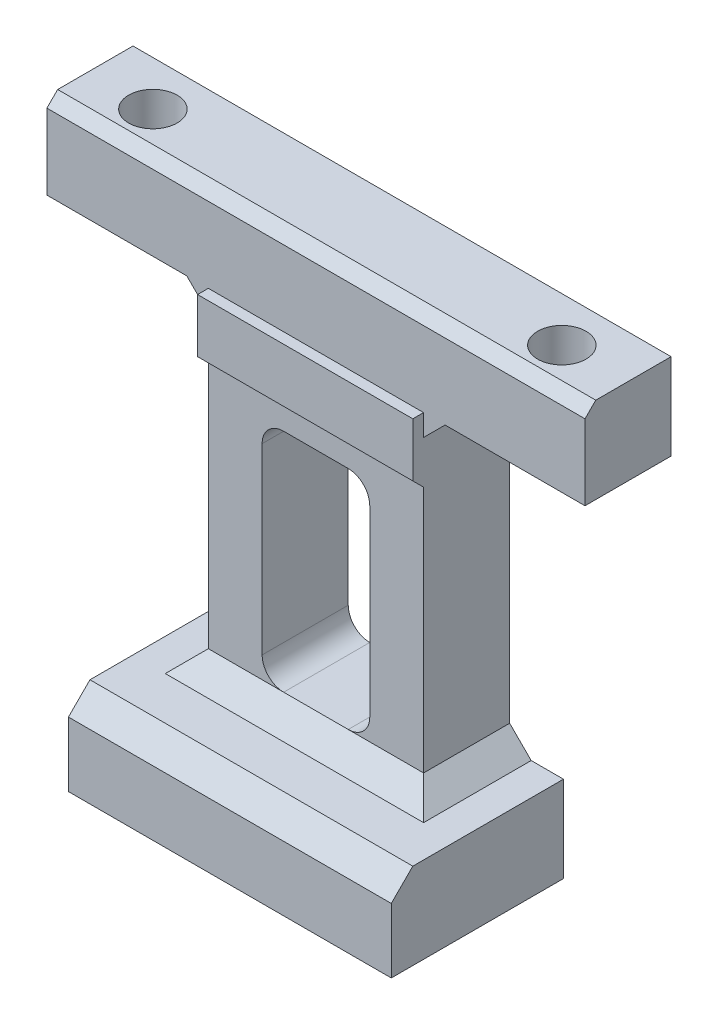
ISO-10303-21;
HEADER;
FILE_DESCRIPTION(('STEP AP214'),'2;1');
FILE_NAME('part.step','',(''),(''),'','','');
FILE_SCHEMA(('AUTOMOTIVE_DESIGN { 1 0 10303 214 1 1 1 1 }'));
ENDSEC;
DATA;
#1=APPLICATION_CONTEXT('core data for automotive mechanical design processes');
#2=APPLICATION_PROTOCOL_DEFINITION('international standard','automotive_design',2000,#1);
#3=PRODUCT_CONTEXT('',#1,'mechanical');
#4=PRODUCT('Part','Part','',(#3));
#5=PRODUCT_RELATED_PRODUCT_CATEGORY('part','',(#4));
#6=PRODUCT_DEFINITION_FORMATION('','',#4);
#7=PRODUCT_DEFINITION_CONTEXT('part definition',#1,'design');
#8=PRODUCT_DEFINITION('design','',#6,#7);
#9=PRODUCT_DEFINITION_SHAPE('','',#8);
#10=(LENGTH_UNIT() NAMED_UNIT(*) SI_UNIT(.MILLI.,.METRE.));
#11=(NAMED_UNIT(*) PLANE_ANGLE_UNIT() SI_UNIT($,.RADIAN.));
#12=(NAMED_UNIT(*) SI_UNIT($,.STERADIAN.) SOLID_ANGLE_UNIT());
#13=UNCERTAINTY_MEASURE_WITH_UNIT(LENGTH_MEASURE(1.E-05),#10,'distance_accuracy_value','');
#14=(GEOMETRIC_REPRESENTATION_CONTEXT(3) GLOBAL_UNCERTAINTY_ASSIGNED_CONTEXT((#13)) GLOBAL_UNIT_ASSIGNED_CONTEXT((#10,
#11,#12)) REPRESENTATION_CONTEXT('',''));
#15=CARTESIAN_POINT('',(0.,0.,0.));
#16=DIRECTION('',(0.,0.,1.));
#17=DIRECTION('',(1.,0.,0.));
#18=AXIS2_PLACEMENT_3D('',#15,#16,#17);
#19=CARTESIAN_POINT('',(0.,0.,0.));
#20=DIRECTION('',(0.,0.,1.));
#21=DIRECTION('',(1.,0.,0.));
#22=AXIS2_PLACEMENT_3D('',#19,#20,#21);
#23=PLANE('',#22);
#24=DIRECTION('',(0.,-1.,0.));
#25=VECTOR('',#24,1.);
#26=CARTESIAN_POINT('',(-10.,39.,0.));
#27=LINE('',#26,#25);
#28=CARTESIAN_POINT('',(-10.,33.,0.));
#29=VERTEX_POINT('',#28);
#30=CARTESIAN_POINT('',(-9.99999999999999,9.99999999999999,0.));
#31=VERTEX_POINT('',#30);
#32=EDGE_CURVE('E463',#29,#31,#27,.T.);
#33=ORIENTED_EDGE('',*,*,#32,.T.);
#34=DIRECTION('',(1.,0.,0.));
#35=VECTOR('',#34,1.);
#36=CARTESIAN_POINT('',(0.,9.99999999999999,0.));
#37=LINE('',#36,#35);
#38=CARTESIAN_POINT('',(-3.,9.99999999999999,0.));
#39=VERTEX_POINT('',#38);
#40=EDGE_CURVE('E619',#31,#39,#37,.T.);
#41=ORIENTED_EDGE('',*,*,#40,.T.);
#42=CARTESIAN_POINT('',(-3.,12.,0.));
#43=DIRECTION('',(0.,0.,1.));
#44=DIRECTION('',(1.,0.,0.));
#45=AXIS2_PLACEMENT_3D('',#42,#43,#44);
#46=CIRCLE('',#45,2.);
#47=CARTESIAN_POINT('',(-5.,12.,0.));
#48=VERTEX_POINT('',#47);
#49=EDGE_CURVE('E585',#39,#48,#46,.F.);
#50=ORIENTED_EDGE('',*,*,#49,.T.);
#51=DIRECTION('',(0.,-1.,0.));
#52=VECTOR('',#51,1.);
#53=CARTESIAN_POINT('',(-5.,31.,0.));
#54=LINE('',#53,#52);
#55=CARTESIAN_POINT('',(-5.,29.,0.));
#56=VERTEX_POINT('',#55);
#57=EDGE_CURVE('E372',#56,#48,#54,.T.);
#58=ORIENTED_EDGE('',*,*,#57,.F.);
#59=CARTESIAN_POINT('',(-3.,29.,0.));
#60=DIRECTION('',(0.,0.,1.));
#61=DIRECTION('',(1.,0.,0.));
#62=AXIS2_PLACEMENT_3D('',#59,#60,#61);
#63=CIRCLE('',#62,2.);
#64=CARTESIAN_POINT('',(-3.,31.,0.));
#65=VERTEX_POINT('',#64);
#66=EDGE_CURVE('E579',#56,#65,#63,.F.);
#67=ORIENTED_EDGE('',*,*,#66,.T.);
#68=DIRECTION('',(-1.,0.,0.));
#69=VECTOR('',#68,1.);
#70=CARTESIAN_POINT('',(-5.,31.,0.));
#71=LINE('',#70,#69);
#72=CARTESIAN_POINT('',(3.,31.,0.));
#73=VERTEX_POINT('',#72);
#74=EDGE_CURVE('E368',#73,#65,#71,.T.);
#75=ORIENTED_EDGE('',*,*,#74,.F.);
#76=CARTESIAN_POINT('',(3.,29.,0.));
#77=DIRECTION('',(0.,0.,1.));
#78=DIRECTION('',(1.,0.,0.));
#79=AXIS2_PLACEMENT_3D('',#76,#77,#78);
#80=CIRCLE('',#79,2.);
#81=CARTESIAN_POINT('',(5.,29.,0.));
#82=VERTEX_POINT('',#81);
#83=EDGE_CURVE('E573',#73,#82,#80,.F.);
#84=ORIENTED_EDGE('',*,*,#83,.T.);
#85=DIRECTION('',(0.,1.,0.));
#86=VECTOR('',#85,1.);
#87=CARTESIAN_POINT('',(5.,31.,0.));
#88=LINE('',#87,#86);
#89=CARTESIAN_POINT('',(5.,12.,0.));
#90=VERTEX_POINT('',#89);
#91=EDGE_CURVE('E336',#90,#82,#88,.T.);
#92=ORIENTED_EDGE('',*,*,#91,.F.);
#93=CARTESIAN_POINT('',(3.,12.,0.));
#94=DIRECTION('',(0.,0.,1.));
#95=DIRECTION('',(1.,0.,0.));
#96=AXIS2_PLACEMENT_3D('',#93,#94,#95);
#97=CIRCLE('',#96,2.);
#98=CARTESIAN_POINT('',(3.,9.99999999999999,0.));
#99=VERTEX_POINT('',#98);
#100=EDGE_CURVE('E567',#90,#99,#97,.F.);
#101=ORIENTED_EDGE('',*,*,#100,.T.);
#102=DIRECTION('',(1.,0.,0.));
#103=VECTOR('',#102,1.);
#104=CARTESIAN_POINT('',(0.,9.99999999999999,0.));
#105=LINE('',#104,#103);
#106=CARTESIAN_POINT('',(10.,9.99999999999999,0.));
#107=VERTEX_POINT('',#106);
#108=EDGE_CURVE('E96',#99,#107,#105,.T.);
#109=ORIENTED_EDGE('',*,*,#108,.T.);
#110=DIRECTION('',(0.,1.,0.));
#111=VECTOR('',#110,1.);
#112=CARTESIAN_POINT('',(10.,5.,0.));
#113=LINE('',#112,#111);
#114=CARTESIAN_POINT('',(10.,33.,0.));
#115=VERTEX_POINT('',#114);
#116=EDGE_CURVE('E460',#107,#115,#113,.T.);
#117=ORIENTED_EDGE('',*,*,#116,.T.);
#118=DIRECTION('',(-1.,0.,0.));
#119=VECTOR('',#118,1.);
#120=CARTESIAN_POINT('',(0.,33.,0.));
#121=LINE('',#120,#119);
#122=EDGE_CURVE('E523',#115,#29,#121,.T.);
#123=ORIENTED_EDGE('',*,*,#122,.T.);
#124=EDGE_LOOP('',(#33,#41,#50,#58,#67,#75,#84,#92,#101,#109,#117,#123));
#125=FACE_BOUND('',#124,.T.);
#126=ADVANCED_FACE('F77',(#125),#23,.T.);
#127=DIRECTION('',(0.,1.,0.));
#128=VECTOR('',#127,1.);
#129=CARTESIAN_POINT('',(25.,39.,0.));
#130=LINE('',#129,#128);
#131=CARTESIAN_POINT('',(25.,39.,0.));
#132=VERTEX_POINT('',#131);
#133=CARTESIAN_POINT('',(25.,46.,0.));
#134=VERTEX_POINT('',#133);
#135=EDGE_CURVE('E414',#132,#134,#130,.T.);
#136=ORIENTED_EDGE('',*,*,#135,.T.);
#137=DIRECTION('',(-1.,0.,0.));
#138=VECTOR('',#137,1.);
#139=CARTESIAN_POINT('',(0.,46.,0.));
#140=LINE('',#139,#138);
#141=CARTESIAN_POINT('',(-25.,46.,0.));
#142=VERTEX_POINT('',#141);
#143=EDGE_CURVE('E444',#134,#142,#140,.T.);
#144=ORIENTED_EDGE('',*,*,#143,.T.);
#145=DIRECTION('',(0.,-1.,0.));
#146=VECTOR('',#145,1.);
#147=CARTESIAN_POINT('',(-25.,47.,0.));
#148=LINE('',#147,#146);
#149=CARTESIAN_POINT('',(-25.,39.,0.));
#150=VERTEX_POINT('',#149);
#151=EDGE_CURVE('E428',#142,#150,#148,.T.);
#152=ORIENTED_EDGE('',*,*,#151,.T.);
#153=DIRECTION('',(1.,0.,0.));
#154=VECTOR('',#153,1.);
#155=CARTESIAN_POINT('',(-25.,39.,0.));
#156=LINE('',#155,#154);
#157=CARTESIAN_POINT('',(-12.,39.,0.));
#158=VERTEX_POINT('',#157);
#159=EDGE_CURVE('E433',#150,#158,#156,.T.);
#160=ORIENTED_EDGE('',*,*,#159,.T.);
#161=DIRECTION('',(-0.707106781186552,0.707106781186543,0.));
#162=VECTOR('',#161,1.);
#163=CARTESIAN_POINT('',(-12.,39.,0.));
#164=LINE('',#163,#162);
#165=CARTESIAN_POINT('',(-10.,37.,0.));
#166=VERTEX_POINT('',#165);
#167=EDGE_CURVE('E517',#158,#166,#164,.F.);
#168=ORIENTED_EDGE('',*,*,#167,.T.);
#169=DIRECTION('',(0.,-1.,0.));
#170=VECTOR('',#169,1.);
#171=CARTESIAN_POINT('',(-9.99999999999999,0.,0.));
#172=LINE('',#171,#170);
#173=CARTESIAN_POINT('',(-10.,39.,0.));
#174=VERTEX_POINT('',#173);
#175=EDGE_CURVE('E506',#174,#166,#172,.T.);
#176=ORIENTED_EDGE('',*,*,#175,.F.);
#177=DIRECTION('',(-1.,0.,0.));
#178=VECTOR('',#177,1.);
#179=CARTESIAN_POINT('',(-10.,39.,0.));
#180=LINE('',#179,#178);
#181=CARTESIAN_POINT('',(10.,39.,0.));
#182=VERTEX_POINT('',#181);
#183=EDGE_CURVE('E391',#182,#174,#180,.T.);
#184=ORIENTED_EDGE('',*,*,#183,.F.);
#185=DIRECTION('',(0.,1.,0.));
#186=VECTOR('',#185,1.);
#187=CARTESIAN_POINT('',(10.,0.,0.));
#188=LINE('',#187,#186);
#189=CARTESIAN_POINT('',(10.,37.,0.));
#190=VERTEX_POINT('',#189);
#191=EDGE_CURVE('E489',#190,#182,#188,.T.);
#192=ORIENTED_EDGE('',*,*,#191,.F.);
#193=DIRECTION('',(-0.707106781186542,-0.707106781186553,0.));
#194=VECTOR('',#193,1.);
#195=CARTESIAN_POINT('',(10.,37.,0.));
#196=LINE('',#195,#194);
#197=CARTESIAN_POINT('',(12.,39.,0.));
#198=VERTEX_POINT('',#197);
#199=EDGE_CURVE('E510',#190,#198,#196,.F.);
#200=ORIENTED_EDGE('',*,*,#199,.T.);
#201=EDGE_CURVE('E431',#198,#132,#156,.T.);
#202=ORIENTED_EDGE('',*,*,#201,.T.);
#203=EDGE_LOOP('',(#136,#144,#152,#160,#168,#176,#184,#192,#200,#202));
#204=FACE_BOUND('',#203,.T.);
#205=ADVANCED_FACE('F680',(#204),#23,.T.);
#206=CARTESIAN_POINT('',(25.,47.,-8.));
#207=DIRECTION('',(0.,1.,0.));
#208=DIRECTION('',(-1.,0.,0.));
#209=AXIS2_PLACEMENT_3D('',#206,#207,#208);
#210=PLANE('',#209);
#211=CARTESIAN_POINT('',(19.,47.,-3.8474065138723));
#212=DIRECTION('',(0.,1.,0.));
#213=DIRECTION('',(-1.,0.,0.));
#214=AXIS2_PLACEMENT_3D('',#211,#212,#213);
#215=CIRCLE('',#214,2.25);
#216=CARTESIAN_POINT('',(16.75,47.,-3.8474065138723));
#217=VERTEX_POINT('',#216);
#218=EDGE_CURVE('E379',#217,#217,#215,.T.);
#219=ORIENTED_EDGE('',*,*,#218,.F.);
#220=EDGE_LOOP('',(#219));
#221=FACE_BOUND('',#220,.T.);
#222=CARTESIAN_POINT('',(-19.,47.,-3.8474065138723));
#223=DIRECTION('',(0.,1.,0.));
#224=DIRECTION('',(-1.,0.,0.));
#225=AXIS2_PLACEMENT_3D('',#222,#223,#224);
#226=CIRCLE('',#225,2.25);
#227=CARTESIAN_POINT('',(-21.25,47.,-3.8474065138723));
#228=VERTEX_POINT('',#227);
#229=EDGE_CURVE('E290',#228,#228,#226,.T.);
#230=ORIENTED_EDGE('',*,*,#229,.F.);
#231=EDGE_LOOP('',(#230));
#232=FACE_BOUND('',#231,.T.);
#233=DIRECTION('',(0.,0.,1.));
#234=VECTOR('',#233,1.);
#235=CARTESIAN_POINT('',(-25.,47.,-8.));
#236=LINE('',#235,#234);
#237=CARTESIAN_POINT('',(-25.,47.,-8.));
#238=VERTEX_POINT('',#237);
#239=CARTESIAN_POINT('',(-25.,47.,-1.00000000000001));
#240=VERTEX_POINT('',#239);
#241=EDGE_CURVE('E440',#238,#240,#236,.T.);
#242=ORIENTED_EDGE('',*,*,#241,.T.);
#243=DIRECTION('',(1.,0.,0.));
#244=VECTOR('',#243,1.);
#245=CARTESIAN_POINT('',(25.,47.,-1.00000000000001));
#246=LINE('',#245,#244);
#247=CARTESIAN_POINT('',(25.,47.,-1.00000000000001));
#248=VERTEX_POINT('',#247);
#249=EDGE_CURVE('E483',#240,#248,#246,.T.);
#250=ORIENTED_EDGE('',*,*,#249,.T.);
#251=DIRECTION('',(0.,0.,1.));
#252=VECTOR('',#251,1.);
#253=CARTESIAN_POINT('',(25.,47.,-8.));
#254=LINE('',#253,#252);
#255=CARTESIAN_POINT('',(25.,47.,-8.));
#256=VERTEX_POINT('',#255);
#257=EDGE_CURVE('E445',#256,#248,#254,.T.);
#258=ORIENTED_EDGE('',*,*,#257,.F.);
#259=DIRECTION('',(-1.,0.,0.));
#260=VECTOR('',#259,1.);
#261=CARTESIAN_POINT('',(25.,47.,-8.));
#262=LINE('',#261,#260);
#263=EDGE_CURVE('E423',#256,#238,#262,.T.);
#264=ORIENTED_EDGE('',*,*,#263,.T.);
#265=EDGE_LOOP('',(#242,#250,#258,#264));
#266=FACE_BOUND('',#265,.T.);
#267=ADVANCED_FACE('F696',(#221,#232,#266),#210,.T.);
#268=CARTESIAN_POINT('',(25.,39.,-8.));
#269=DIRECTION('',(1.,0.,0.));
#270=DIRECTION('',(0.,0.,-1.));
#271=AXIS2_PLACEMENT_3D('',#268,#269,#270);
#272=PLANE('',#271);
#273=ORIENTED_EDGE('',*,*,#257,.T.);
#274=DIRECTION('',(0.,0.707106781186544,-0.707106781186551));
#275=VECTOR('',#274,1.);
#276=CARTESIAN_POINT('',(25.,46.5,-0.500000000000048));
#277=LINE('',#276,#275);
#278=EDGE_CURVE('E486',#248,#134,#277,.F.);
#279=ORIENTED_EDGE('',*,*,#278,.T.);
#280=ORIENTED_EDGE('',*,*,#135,.F.);
#281=DIRECTION('',(0.,0.,1.));
#282=VECTOR('',#281,1.);
#283=CARTESIAN_POINT('',(25.,39.,-8.));
#284=LINE('',#283,#282);
#285=CARTESIAN_POINT('',(25.,39.,-8.));
#286=VERTEX_POINT('',#285);
#287=EDGE_CURVE('E449',#286,#132,#284,.T.);
#288=ORIENTED_EDGE('',*,*,#287,.F.);
#289=DIRECTION('',(0.,1.,0.));
#290=VECTOR('',#289,1.);
#291=CARTESIAN_POINT('',(25.,39.,-8.));
#292=LINE('',#291,#290);
#293=EDGE_CURVE('E419',#286,#256,#292,.T.);
#294=ORIENTED_EDGE('',*,*,#293,.T.);
#295=EDGE_LOOP('',(#273,#279,#280,#288,#294));
#296=FACE_BOUND('',#295,.T.);
#297=ADVANCED_FACE('F701',(#296),#272,.T.);
#298=CARTESIAN_POINT('',(-25.,47.,-8.));
#299=DIRECTION('',(-1.,0.,0.));
#300=DIRECTION('',(0.,-1.,0.));
#301=AXIS2_PLACEMENT_3D('',#298,#299,#300);
#302=PLANE('',#301);
#303=ORIENTED_EDGE('',*,*,#151,.F.);
#304=DIRECTION('',(0.,-0.707106781186544,0.707106781186551));
#305=VECTOR('',#304,1.);
#306=CARTESIAN_POINT('',(-25.,50.5,-4.50000000000004));
#307=LINE('',#306,#305);
#308=EDGE_CURVE('E480',#142,#240,#307,.F.);
#309=ORIENTED_EDGE('',*,*,#308,.T.);
#310=ORIENTED_EDGE('',*,*,#241,.F.);
#311=DIRECTION('',(0.,-1.,0.));
#312=VECTOR('',#311,1.);
#313=CARTESIAN_POINT('',(-25.,47.,-8.));
#314=LINE('',#313,#312);
#315=CARTESIAN_POINT('',(-25.,39.,-8.));
#316=VERTEX_POINT('',#315);
#317=EDGE_CURVE('E409',#238,#316,#314,.T.);
#318=ORIENTED_EDGE('',*,*,#317,.T.);
#319=DIRECTION('',(0.,0.,1.));
#320=VECTOR('',#319,1.);
#321=CARTESIAN_POINT('',(-25.,39.,-8.));
#322=LINE('',#321,#320);
#323=EDGE_CURVE('E427',#316,#150,#322,.T.);
#324=ORIENTED_EDGE('',*,*,#323,.T.);
#325=EDGE_LOOP('',(#303,#309,#310,#318,#324));
#326=FACE_BOUND('',#325,.T.);
#327=ADVANCED_FACE('F692',(#326),#302,.T.);
#328=CARTESIAN_POINT('',(0.,0.,-8.));
#329=DIRECTION('',(0.,0.,1.));
#330=DIRECTION('',(1.,0.,0.));
#331=AXIS2_PLACEMENT_3D('',#328,#329,#330);
#332=PLANE('',#331);
#333=DIRECTION('',(0.,-1.,0.));
#334=VECTOR('',#333,1.);
#335=CARTESIAN_POINT('',(-5.,31.,-8.));
#336=LINE('',#335,#334);
#337=CARTESIAN_POINT('',(-5.,29.,-8.));
#338=VERTEX_POINT('',#337);
#339=CARTESIAN_POINT('',(-5.,12.,-8.));
#340=VERTEX_POINT('',#339);
#341=EDGE_CURVE('E358',#338,#340,#336,.T.);
#342=ORIENTED_EDGE('',*,*,#341,.T.);
#343=CARTESIAN_POINT('',(-3.,12.,-8.));
#344=DIRECTION('',(0.,0.,1.));
#345=DIRECTION('',(1.,0.,0.));
#346=AXIS2_PLACEMENT_3D('',#343,#344,#345);
#347=CIRCLE('',#346,2.);
#348=CARTESIAN_POINT('',(-3.,9.99999999999999,-8.));
#349=VERTEX_POINT('',#348);
#350=EDGE_CURVE('E588',#340,#349,#347,.T.);
#351=ORIENTED_EDGE('',*,*,#350,.T.);
#352=DIRECTION('',(1.,0.,0.));
#353=VECTOR('',#352,1.);
#354=CARTESIAN_POINT('',(-5.,9.99999999999999,-8.));
#355=LINE('',#354,#353);
#356=CARTESIAN_POINT('',(3.,9.99999999999999,-8.));
#357=VERTEX_POINT('',#356);
#358=EDGE_CURVE('E291',#349,#357,#355,.T.);
#359=ORIENTED_EDGE('',*,*,#358,.T.);
#360=CARTESIAN_POINT('',(3.,12.,-8.));
#361=DIRECTION('',(0.,0.,1.));
#362=DIRECTION('',(1.,0.,0.));
#363=AXIS2_PLACEMENT_3D('',#360,#361,#362);
#364=CIRCLE('',#363,2.);
#365=CARTESIAN_POINT('',(5.,12.,-8.));
#366=VERTEX_POINT('',#365);
#367=EDGE_CURVE('E570',#357,#366,#364,.T.);
#368=ORIENTED_EDGE('',*,*,#367,.T.);
#369=DIRECTION('',(0.,1.,0.));
#370=VECTOR('',#369,1.);
#371=CARTESIAN_POINT('',(5.,31.,-8.));
#372=LINE('',#371,#370);
#373=CARTESIAN_POINT('',(5.,29.,-8.));
#374=VERTEX_POINT('',#373);
#375=EDGE_CURVE('E349',#366,#374,#372,.T.);
#376=ORIENTED_EDGE('',*,*,#375,.T.);
#377=CARTESIAN_POINT('',(3.,29.,-8.));
#378=DIRECTION('',(0.,0.,1.));
#379=DIRECTION('',(1.,0.,0.));
#380=AXIS2_PLACEMENT_3D('',#377,#378,#379);
#381=CIRCLE('',#380,2.);
#382=CARTESIAN_POINT('',(3.,31.,-8.));
#383=VERTEX_POINT('',#382);
#384=EDGE_CURVE('E576',#374,#383,#381,.T.);
#385=ORIENTED_EDGE('',*,*,#384,.T.);
#386=DIRECTION('',(-1.,0.,0.));
#387=VECTOR('',#386,1.);
#388=CARTESIAN_POINT('',(-5.,31.,-8.));
#389=LINE('',#388,#387);
#390=CARTESIAN_POINT('',(-3.,31.,-8.));
#391=VERTEX_POINT('',#390);
#392=EDGE_CURVE('E353',#383,#391,#389,.T.);
#393=ORIENTED_EDGE('',*,*,#392,.T.);
#394=CARTESIAN_POINT('',(-3.,29.,-8.));
#395=DIRECTION('',(0.,0.,1.));
#396=DIRECTION('',(1.,0.,0.));
#397=AXIS2_PLACEMENT_3D('',#394,#395,#396);
#398=CIRCLE('',#397,2.);
#399=EDGE_CURVE('E582',#391,#338,#398,.T.);
#400=ORIENTED_EDGE('',*,*,#399,.T.);
#401=EDGE_LOOP('',(#342,#351,#359,#368,#376,#385,#393,#400));
#402=FACE_BOUND('',#401,.T.);
#403=ORIENTED_EDGE('',*,*,#317,.F.);
#404=ORIENTED_EDGE('',*,*,#263,.F.);
#405=ORIENTED_EDGE('',*,*,#293,.F.);
#406=DIRECTION('',(1.,0.,0.));
#407=VECTOR('',#406,1.);
#408=CARTESIAN_POINT('',(-25.,39.,-8.));
#409=LINE('',#408,#407);
#410=CARTESIAN_POINT('',(12.,39.,-8.));
#411=VERTEX_POINT('',#410);
#412=EDGE_CURVE('E413',#411,#286,#409,.T.);
#413=ORIENTED_EDGE('',*,*,#412,.F.);
#414=DIRECTION('',(0.707106781186542,0.707106781186553,0.));
#415=VECTOR('',#414,1.);
#416=CARTESIAN_POINT('',(-13.4999999999999,13.4999999999997,-8.));
#417=LINE('',#416,#415);
#418=CARTESIAN_POINT('',(10.,37.,-8.));
#419=VERTEX_POINT('',#418);
#420=EDGE_CURVE('E513',#411,#419,#417,.F.);
#421=ORIENTED_EDGE('',*,*,#420,.T.);
#422=DIRECTION('',(0.,1.,0.));
#423=VECTOR('',#422,1.);
#424=CARTESIAN_POINT('',(10.,5.,-8.));
#425=LINE('',#424,#423);
#426=CARTESIAN_POINT('',(10.,9.99999999999999,-8.));
#427=VERTEX_POINT('',#426);
#428=EDGE_CURVE('E432',#427,#419,#425,.T.);
#429=ORIENTED_EDGE('',*,*,#428,.F.);
#430=DIRECTION('',(0.707106781186551,-0.707106781186544,0.));
#431=VECTOR('',#430,1.);
#432=CARTESIAN_POINT('',(9.99999999999995,10.,-8.));
#433=LINE('',#432,#431);
#434=CARTESIAN_POINT('',(12.,8.,-8.));
#435=VERTEX_POINT('',#434);
#436=EDGE_CURVE('E12',#427,#435,#433,.T.);
#437=ORIENTED_EDGE('',*,*,#436,.T.);
#438=DIRECTION('',(1.,0.,0.));
#439=VECTOR('',#438,1.);
#440=CARTESIAN_POINT('',(10.,8.,-8.));
#441=LINE('',#440,#439);
#442=CARTESIAN_POINT('',(15.,8.,-8.));
#443=VERTEX_POINT('',#442);
#444=EDGE_CURVE('E314',#435,#443,#441,.T.);
#445=ORIENTED_EDGE('',*,*,#444,.T.);
#446=DIRECTION('',(0.,-1.,0.));
#447=VECTOR('',#446,1.);
#448=CARTESIAN_POINT('',(15.,0.,-8.));
#449=LINE('',#448,#447);
#450=CARTESIAN_POINT('',(15.,0.,-8.));
#451=VERTEX_POINT('',#450);
#452=EDGE_CURVE('E317',#443,#451,#449,.T.);
#453=ORIENTED_EDGE('',*,*,#452,.T.);
#454=DIRECTION('',(1.,0.,0.));
#455=VECTOR('',#454,1.);
#456=CARTESIAN_POINT('',(-10.,0.,-8.));
#457=LINE('',#456,#455);
#458=CARTESIAN_POINT('',(-15.,0.,-8.));
#459=VERTEX_POINT('',#458);
#460=EDGE_CURVE('E296',#459,#451,#457,.T.);
#461=ORIENTED_EDGE('',*,*,#460,.F.);
#462=DIRECTION('',(0.,1.,0.));
#463=VECTOR('',#462,1.);
#464=CARTESIAN_POINT('',(-15.,0.,-8.));
#465=LINE('',#464,#463);
#466=CARTESIAN_POINT('',(-15.,8.,-8.));
#467=VERTEX_POINT('',#466);
#468=EDGE_CURVE('E323',#459,#467,#465,.T.);
#469=ORIENTED_EDGE('',*,*,#468,.T.);
#470=DIRECTION('',(1.,0.,0.));
#471=VECTOR('',#470,1.);
#472=CARTESIAN_POINT('',(-10.,8.,-8.));
#473=LINE('',#472,#471);
#474=CARTESIAN_POINT('',(-12.,8.,-8.));
#475=VERTEX_POINT('',#474);
#476=EDGE_CURVE('E319',#467,#475,#473,.T.);
#477=ORIENTED_EDGE('',*,*,#476,.T.);
#478=DIRECTION('',(0.707106781186551,0.707106781186544,0.));
#479=VECTOR('',#478,1.);
#480=CARTESIAN_POINT('',(-9.99999999999994,10.,-8.));
#481=LINE('',#480,#479);
#482=CARTESIAN_POINT('',(-9.99999999999999,9.99999999999999,-8.));
#483=VERTEX_POINT('',#482);
#484=EDGE_CURVE('E88',#475,#483,#481,.T.);
#485=ORIENTED_EDGE('',*,*,#484,.T.);
#486=DIRECTION('',(0.,-1.,0.));
#487=VECTOR('',#486,1.);
#488=CARTESIAN_POINT('',(-10.,39.,-8.));
#489=LINE('',#488,#487);
#490=CARTESIAN_POINT('',(-10.,37.,-8.));
#491=VERTEX_POINT('',#490);
#492=EDGE_CURVE('E456',#491,#483,#489,.T.);
#493=ORIENTED_EDGE('',*,*,#492,.F.);
#494=DIRECTION('',(0.707106781186552,-0.707106781186543,0.));
#495=VECTOR('',#494,1.);
#496=CARTESIAN_POINT('',(13.5000000000001,13.5000000000003,-8.));
#497=LINE('',#496,#495);
#498=CARTESIAN_POINT('',(-12.,39.,-8.));
#499=VERTEX_POINT('',#498);
#500=EDGE_CURVE('E520',#491,#499,#497,.F.);
#501=ORIENTED_EDGE('',*,*,#500,.T.);
#502=EDGE_CURVE('E415',#316,#499,#409,.T.);
#503=ORIENTED_EDGE('',*,*,#502,.F.);
#504=EDGE_LOOP('',(#403,#404,#405,#413,#421,#429,#437,#445,#453,#461,#469,#477,#485,#493,#501,#503));
#505=FACE_BOUND('',#504,.T.);
#506=ADVANCED_FACE('F643',(#402,#505),#332,.F.);
#507=CARTESIAN_POINT('',(-25.,39.,-8.));
#508=DIRECTION('',(0.,-1.,0.));
#509=DIRECTION('',(0.,0.,-1.));
#510=AXIS2_PLACEMENT_3D('',#507,#508,#509);
#511=PLANE('',#510);
#512=CARTESIAN_POINT('',(-19.,39.,-3.8474065138723));
#513=DIRECTION('',(0.,-1.,0.));
#514=DIRECTION('',(0.,0.,-1.));
#515=AXIS2_PLACEMENT_3D('',#512,#513,#514);
#516=CIRCLE('',#515,2.25);
#517=CARTESIAN_POINT('',(-19.,39.,-6.0974065138723));
#518=VERTEX_POINT('',#517);
#519=EDGE_CURVE('E401',#518,#518,#516,.T.);
#520=ORIENTED_EDGE('',*,*,#519,.F.);
#521=EDGE_LOOP('',(#520));
#522=FACE_BOUND('',#521,.T.);
#523=ORIENTED_EDGE('',*,*,#502,.T.);
#524=DIRECTION('',(0.,0.,1.));
#525=VECTOR('',#524,1.);
#526=CARTESIAN_POINT('',(-12.,39.,0.));
#527=LINE('',#526,#525);
#528=EDGE_CURVE('E499',#499,#158,#527,.T.);
#529=ORIENTED_EDGE('',*,*,#528,.T.);
#530=ORIENTED_EDGE('',*,*,#159,.F.);
#531=ORIENTED_EDGE('',*,*,#323,.F.);
#532=EDGE_LOOP('',(#523,#529,#530,#531));
#533=FACE_BOUND('',#532,.T.);
#534=ADVANCED_FACE('F688',(#522,#533),#511,.T.);
#535=CARTESIAN_POINT('',(19.,39.,-3.8474065138723));
#536=DIRECTION('',(0.,-1.,0.));
#537=DIRECTION('',(0.,0.,-1.));
#538=AXIS2_PLACEMENT_3D('',#535,#536,#537);
#539=CIRCLE('',#538,2.25);
#540=CARTESIAN_POINT('',(19.,39.,-6.0974065138723));
#541=VERTEX_POINT('',#540);
#542=EDGE_CURVE('E383',#541,#541,#539,.T.);
#543=ORIENTED_EDGE('',*,*,#542,.F.);
#544=EDGE_LOOP('',(#543));
#545=FACE_BOUND('',#544,.T.);
#546=ORIENTED_EDGE('',*,*,#201,.F.);
#547=DIRECTION('',(0.,0.,-1.));
#548=VECTOR('',#547,1.);
#549=CARTESIAN_POINT('',(12.,39.,-8.));
#550=LINE('',#549,#548);
#551=EDGE_CURVE('E496',#198,#411,#550,.T.);
#552=ORIENTED_EDGE('',*,*,#551,.T.);
#553=ORIENTED_EDGE('',*,*,#412,.T.);
#554=ORIENTED_EDGE('',*,*,#287,.T.);
#555=EDGE_LOOP('',(#546,#552,#553,#554));
#556=FACE_BOUND('',#555,.T.);
#557=ADVANCED_FACE('F736',(#545,#556),#511,.T.);
#558=CARTESIAN_POINT('',(0.,0.,-8.));
#559=DIRECTION('',(0.,-1.,0.));
#560=DIRECTION('',(0.,0.,-1.));
#561=AXIS2_PLACEMENT_3D('',#558,#559,#560);
#562=PLANE('',#561);
#563=CARTESIAN_POINT('',(-6.,0.,0.));
#564=DIRECTION('',(0.,-1.,0.));
#565=DIRECTION('',(0.,0.,-1.));
#566=AXIS2_PLACEMENT_3D('',#563,#564,#565);
#567=CIRCLE('',#566,2.4);
#568=CARTESIAN_POINT('',(-6.,0.,-2.4));
#569=VERTEX_POINT('',#568);
#570=EDGE_CURVE('E337',#569,#569,#567,.T.);
#571=ORIENTED_EDGE('',*,*,#570,.F.);
#572=EDGE_LOOP('',(#571));
#573=FACE_BOUND('',#572,.T.);
#574=CARTESIAN_POINT('',(6.,0.,0.));
#575=DIRECTION('',(0.,-1.,0.));
#576=DIRECTION('',(0.,0.,-1.));
#577=AXIS2_PLACEMENT_3D('',#574,#575,#576);
#578=CIRCLE('',#577,2.4);
#579=CARTESIAN_POINT('',(6.,0.,-2.4));
#580=VERTEX_POINT('',#579);
#581=EDGE_CURVE('E341',#580,#580,#578,.T.);
#582=ORIENTED_EDGE('',*,*,#581,.F.);
#583=EDGE_LOOP('',(#582));
#584=FACE_BOUND('',#583,.T.);
#585=ORIENTED_EDGE('',*,*,#460,.T.);
#586=DIRECTION('',(0.,0.,1.));
#587=VECTOR('',#586,1.);
#588=CARTESIAN_POINT('',(15.,0.,-17.4339811320566));
#589=LINE('',#588,#587);
#590=CARTESIAN_POINT('',(15.,0.,8.));
#591=VERTEX_POINT('',#590);
#592=EDGE_CURVE('E294',#451,#591,#589,.T.);
#593=ORIENTED_EDGE('',*,*,#592,.T.);
#594=DIRECTION('',(1.,0.,0.));
#595=VECTOR('',#594,1.);
#596=CARTESIAN_POINT('',(-10.,0.,8.));
#597=LINE('',#596,#595);
#598=CARTESIAN_POINT('',(-15.,0.,8.));
#599=VERTEX_POINT('',#598);
#600=EDGE_CURVE('E277',#599,#591,#597,.T.);
#601=ORIENTED_EDGE('',*,*,#600,.F.);
#602=DIRECTION('',(0.,0.,1.));
#603=VECTOR('',#602,1.);
#604=CARTESIAN_POINT('',(-15.,0.,-17.4339811320566));
#605=LINE('',#604,#603);
#606=EDGE_CURVE('E327',#459,#599,#605,.T.);
#607=ORIENTED_EDGE('',*,*,#606,.F.);
#608=EDGE_LOOP('',(#585,#593,#601,#607));
#609=FACE_BOUND('',#608,.T.);
#610=ADVANCED_FACE('F295',(#573,#584,#609),#562,.T.);
#611=CARTESIAN_POINT('',(-10.,39.,-8.));
#612=DIRECTION('',(-1.,0.,0.));
#613=DIRECTION('',(0.,-1.,0.));
#614=AXIS2_PLACEMENT_3D('',#611,#612,#613);
#615=PLANE('',#614);
#616=ORIENTED_EDGE('',*,*,#492,.T.);
#617=DIRECTION('',(0.,0.,1.));
#618=VECTOR('',#617,1.);
#619=CARTESIAN_POINT('',(-9.99999999999999,9.99999999999999,-8.));
#620=LINE('',#619,#618);
#621=EDGE_CURVE('E602',#483,#31,#620,.T.);
#622=ORIENTED_EDGE('',*,*,#621,.T.);
#623=ORIENTED_EDGE('',*,*,#32,.F.);
#624=DIRECTION('',(0.,0.707106781186544,0.707106781186551));
#625=VECTOR('',#624,1.);
#626=CARTESIAN_POINT('',(-10.,35.,2.00000000000004));
#627=LINE('',#626,#625);
#628=CARTESIAN_POINT('',(-10.,34.,1.));
#629=VERTEX_POINT('',#628);
#630=EDGE_CURVE('E535',#29,#629,#627,.T.);
#631=ORIENTED_EDGE('',*,*,#630,.T.);
#632=DIRECTION('',(0.,-1.,0.));
#633=VECTOR('',#632,1.);
#634=CARTESIAN_POINT('',(-10.,39.,1.));
#635=LINE('',#634,#633);
#636=CARTESIAN_POINT('',(-10.,39.,1.));
#637=VERTEX_POINT('',#636);
#638=EDGE_CURVE('E387',#637,#629,#635,.T.);
#639=ORIENTED_EDGE('',*,*,#638,.F.);
#640=DIRECTION('',(0.,0.,-1.));
#641=VECTOR('',#640,1.);
#642=CARTESIAN_POINT('',(-10.,39.,1.));
#643=LINE('',#642,#641);
#644=EDGE_CURVE('E397',#637,#174,#643,.T.);
#645=ORIENTED_EDGE('',*,*,#644,.T.);
#646=ORIENTED_EDGE('',*,*,#175,.T.);
#647=DIRECTION('',(0.,0.,-1.));
#648=VECTOR('',#647,1.);
#649=CARTESIAN_POINT('',(-10.,37.,-8.));
#650=LINE('',#649,#648);
#651=EDGE_CURVE('E503',#166,#491,#650,.T.);
#652=ORIENTED_EDGE('',*,*,#651,.T.);
#653=EDGE_LOOP('',(#616,#622,#623,#631,#639,#645,#646,#652));
#654=FACE_BOUND('',#653,.T.);
#655=ADVANCED_FACE('F662',(#654),#615,.T.);
#656=CARTESIAN_POINT('',(10.,5.,-8.));
#657=DIRECTION('',(1.,0.,0.));
#658=DIRECTION('',(0.,0.,-1.));
#659=AXIS2_PLACEMENT_3D('',#656,#657,#658);
#660=PLANE('',#659);
#661=ORIENTED_EDGE('',*,*,#116,.F.);
#662=DIRECTION('',(0.,0.,-1.));
#663=VECTOR('',#662,1.);
#664=CARTESIAN_POINT('',(10.,9.99999999999999,-8.));
#665=LINE('',#664,#663);
#666=EDGE_CURVE('E103',#107,#427,#665,.T.);
#667=ORIENTED_EDGE('',*,*,#666,.T.);
#668=ORIENTED_EDGE('',*,*,#428,.T.);
#669=DIRECTION('',(0.,0.,1.));
#670=VECTOR('',#669,1.);
#671=CARTESIAN_POINT('',(10.,37.,0.));
#672=LINE('',#671,#670);
#673=EDGE_CURVE('E492',#419,#190,#672,.T.);
#674=ORIENTED_EDGE('',*,*,#673,.T.);
#675=ORIENTED_EDGE('',*,*,#191,.T.);
#676=DIRECTION('',(0.,0.,-1.));
#677=VECTOR('',#676,1.);
#678=CARTESIAN_POINT('',(10.,39.,1.));
#679=LINE('',#678,#677);
#680=CARTESIAN_POINT('',(10.,39.,1.));
#681=VERTEX_POINT('',#680);
#682=EDGE_CURVE('E405',#681,#182,#679,.T.);
#683=ORIENTED_EDGE('',*,*,#682,.F.);
#684=DIRECTION('',(0.,1.,0.));
#685=VECTOR('',#684,1.);
#686=CARTESIAN_POINT('',(10.,39.,1.));
#687=LINE('',#686,#685);
#688=CARTESIAN_POINT('',(10.,34.,1.));
#689=VERTEX_POINT('',#688);
#690=EDGE_CURVE('E390',#689,#681,#687,.T.);
#691=ORIENTED_EDGE('',*,*,#690,.F.);
#692=DIRECTION('',(0.,-0.707106781186544,-0.707106781186551));
#693=VECTOR('',#692,1.);
#694=CARTESIAN_POINT('',(10.,35.,2.00000000000004));
#695=LINE('',#694,#693);
#696=EDGE_CURVE('E531',#689,#115,#695,.T.);
#697=ORIENTED_EDGE('',*,*,#696,.T.);
#698=EDGE_LOOP('',(#661,#667,#668,#674,#675,#683,#691,#697));
#699=FACE_BOUND('',#698,.T.);
#700=ADVANCED_FACE('F711',(#699),#660,.T.);
#701=CARTESIAN_POINT('',(-10.,39.,1.));
#702=DIRECTION('',(0.,-1.,0.));
#703=DIRECTION('',(0.,0.,-1.));
#704=AXIS2_PLACEMENT_3D('',#701,#702,#703);
#705=PLANE('',#704);
#706=ORIENTED_EDGE('',*,*,#183,.T.);
#707=ORIENTED_EDGE('',*,*,#644,.F.);
#708=DIRECTION('',(-1.,0.,0.));
#709=VECTOR('',#708,1.);
#710=CARTESIAN_POINT('',(-10.,39.,1.));
#711=LINE('',#710,#709);
#712=EDGE_CURVE('E394',#681,#637,#711,.T.);
#713=ORIENTED_EDGE('',*,*,#712,.F.);
#714=ORIENTED_EDGE('',*,*,#682,.T.);
#715=EDGE_LOOP('',(#706,#707,#713,#714));
#716=FACE_BOUND('',#715,.T.);
#717=ADVANCED_FACE('F676',(#716),#705,.F.);
#718=CARTESIAN_POINT('',(0.,0.,1.));
#719=DIRECTION('',(0.,0.,1.));
#720=DIRECTION('',(1.,0.,0.));
#721=AXIS2_PLACEMENT_3D('',#718,#719,#720);
#722=PLANE('',#721);
#723=ORIENTED_EDGE('',*,*,#638,.T.);
#724=DIRECTION('',(1.,0.,0.));
#725=VECTOR('',#724,1.);
#726=CARTESIAN_POINT('',(-10.,34.,1.));
#727=LINE('',#726,#725);
#728=EDGE_CURVE('E527',#629,#689,#727,.T.);
#729=ORIENTED_EDGE('',*,*,#728,.T.);
#730=ORIENTED_EDGE('',*,*,#690,.T.);
#731=ORIENTED_EDGE('',*,*,#712,.T.);
#732=EDGE_LOOP('',(#723,#729,#730,#731));
#733=FACE_BOUND('',#732,.T.);
#734=ADVANCED_FACE('F672',(#733),#722,.T.);
#735=CARTESIAN_POINT('',(19.,37.,-3.8474065138723));
#736=DIRECTION('',(0.,1.,0.));
#737=DIRECTION('',(-1.,0.,0.));
#738=AXIS2_PLACEMENT_3D('',#735,#736,#737);
#739=CYLINDRICAL_SURFACE('',#738,2.25);
#740=ORIENTED_EDGE('',*,*,#542,.T.);
#741=EDGE_LOOP('',(#740));
#742=FACE_BOUND('',#741,.T.);
#743=ORIENTED_EDGE('',*,*,#218,.T.);
#744=EDGE_LOOP('',(#743));
#745=FACE_BOUND('',#744,.T.);
#746=ADVANCED_FACE('F798',(#742,#745),#739,.F.);
#747=CARTESIAN_POINT('',(-19.,37.,-3.8474065138723));
#748=DIRECTION('',(0.,1.,0.));
#749=DIRECTION('',(-1.,0.,0.));
#750=AXIS2_PLACEMENT_3D('',#747,#748,#749);
#751=CYLINDRICAL_SURFACE('',#750,2.25);
#752=ORIENTED_EDGE('',*,*,#519,.T.);
#753=EDGE_LOOP('',(#752));
#754=FACE_BOUND('',#753,.T.);
#755=ORIENTED_EDGE('',*,*,#229,.T.);
#756=EDGE_LOOP('',(#755));
#757=FACE_BOUND('',#756,.T.);
#758=ADVANCED_FACE('F801',(#754,#757),#751,.F.);
#759=CARTESIAN_POINT('',(0.,46.,0.));
#760=DIRECTION('',(0.,-0.707106781186551,-0.707106781186544));
#761=DIRECTION('',(-1.,0.,0.));
#762=AXIS2_PLACEMENT_3D('',#759,#760,#761);
#763=PLANE('',#762);
#764=ORIENTED_EDGE('',*,*,#278,.F.);
#765=ORIENTED_EDGE('',*,*,#249,.F.);
#766=ORIENTED_EDGE('',*,*,#308,.F.);
#767=ORIENTED_EDGE('',*,*,#143,.F.);
#768=EDGE_LOOP('',(#764,#765,#766,#767));
#769=FACE_BOUND('',#768,.T.);
#770=ADVANCED_FACE('F805',(#769),#763,.F.);
#771=CARTESIAN_POINT('',(10.,37.,-8.));
#772=DIRECTION('',(0.707106781186553,-0.707106781186542,0.));
#773=DIRECTION('',(0.,0.,-1.));
#774=AXIS2_PLACEMENT_3D('',#771,#772,#773);
#775=PLANE('',#774);
#776=ORIENTED_EDGE('',*,*,#420,.F.);
#777=ORIENTED_EDGE('',*,*,#551,.F.);
#778=ORIENTED_EDGE('',*,*,#199,.F.);
#779=ORIENTED_EDGE('',*,*,#673,.F.);
#780=EDGE_LOOP('',(#776,#777,#778,#779));
#781=FACE_BOUND('',#780,.T.);
#782=ADVANCED_FACE('F710',(#781),#775,.T.);
#783=CARTESIAN_POINT('',(-12.,39.,-8.));
#784=DIRECTION('',(-0.707106781186542,-0.707106781186552,0.));
#785=DIRECTION('',(0.,0.,-1.));
#786=AXIS2_PLACEMENT_3D('',#783,#784,#785);
#787=PLANE('',#786);
#788=ORIENTED_EDGE('',*,*,#500,.F.);
#789=ORIENTED_EDGE('',*,*,#651,.F.);
#790=ORIENTED_EDGE('',*,*,#167,.F.);
#791=ORIENTED_EDGE('',*,*,#528,.F.);
#792=EDGE_LOOP('',(#788,#789,#790,#791));
#793=FACE_BOUND('',#792,.T.);
#794=ADVANCED_FACE('F684',(#793),#787,.T.);
#795=CARTESIAN_POINT('',(-10.,35.,2.00000000000004));
#796=DIRECTION('',(0.,0.707106781186551,-0.707106781186544));
#797=DIRECTION('',(1.,0.,0.));
#798=AXIS2_PLACEMENT_3D('',#795,#796,#797);
#799=PLANE('',#798);
#800=ORIENTED_EDGE('',*,*,#630,.F.);
#801=ORIENTED_EDGE('',*,*,#122,.F.);
#802=ORIENTED_EDGE('',*,*,#696,.F.);
#803=ORIENTED_EDGE('',*,*,#728,.F.);
#804=EDGE_LOOP('',(#800,#801,#802,#803));
#805=FACE_BOUND('',#804,.T.);
#806=ADVANCED_FACE('F667',(#805),#799,.F.);
#807=CARTESIAN_POINT('',(-10.,8.,8.));
#808=DIRECTION('',(0.,-1.,0.));
#809=DIRECTION('',(0.,0.,-1.));
#810=AXIS2_PLACEMENT_3D('',#807,#808,#809);
#811=PLANE('',#810);
#812=DIRECTION('',(-1.,0.,0.));
#813=VECTOR('',#812,1.);
#814=CARTESIAN_POINT('',(-10.,8.,2.00000000000002));
#815=LINE('',#814,#813);
#816=CARTESIAN_POINT('',(12.,8.,2.00000000000002));
#817=VERTEX_POINT('',#816);
#818=CARTESIAN_POINT('',(-12.,8.,2.00000000000002));
#819=VERTEX_POINT('',#818);
#820=EDGE_CURVE('E606',#817,#819,#815,.T.);
#821=ORIENTED_EDGE('',*,*,#820,.T.);
#822=DIRECTION('',(0.,0.,-1.));
#823=VECTOR('',#822,1.);
#824=CARTESIAN_POINT('',(-12.,8.,8.));
#825=LINE('',#824,#823);
#826=EDGE_CURVE('E612',#819,#475,#825,.T.);
#827=ORIENTED_EDGE('',*,*,#826,.T.);
#828=ORIENTED_EDGE('',*,*,#476,.F.);
#829=DIRECTION('',(0.,0.,1.));
#830=VECTOR('',#829,1.);
#831=CARTESIAN_POINT('',(-15.,8.,-17.4339811320566));
#832=LINE('',#831,#830);
#833=CARTESIAN_POINT('',(-15.,8.,6.));
#834=VERTEX_POINT('',#833);
#835=EDGE_CURVE('E310',#467,#834,#832,.T.);
#836=ORIENTED_EDGE('',*,*,#835,.T.);
#837=DIRECTION('',(1.,0.,0.));
#838=VECTOR('',#837,1.);
#839=CARTESIAN_POINT('',(-10.,8.,6.));
#840=LINE('',#839,#838);
#841=CARTESIAN_POINT('',(15.,8.,6.));
#842=VERTEX_POINT('',#841);
#843=EDGE_CURVE('E597',#834,#842,#840,.T.);
#844=ORIENTED_EDGE('',*,*,#843,.T.);
#845=DIRECTION('',(0.,0.,1.));
#846=VECTOR('',#845,1.);
#847=CARTESIAN_POINT('',(15.,8.,-17.4339811320566));
#848=LINE('',#847,#846);
#849=EDGE_CURVE('E301',#443,#842,#848,.T.);
#850=ORIENTED_EDGE('',*,*,#849,.F.);
#851=ORIENTED_EDGE('',*,*,#444,.F.);
#852=DIRECTION('',(0.,0.,1.));
#853=VECTOR('',#852,1.);
#854=CARTESIAN_POINT('',(12.,8.,8.));
#855=LINE('',#854,#853);
#856=EDGE_CURVE('E609',#435,#817,#855,.T.);
#857=ORIENTED_EDGE('',*,*,#856,.T.);
#858=EDGE_LOOP('',(#821,#827,#828,#836,#844,#850,#851,#857));
#859=FACE_BOUND('',#858,.T.);
#860=ADVANCED_FACE('F646',(#859),#811,.F.);
#861=CARTESIAN_POINT('',(0.,0.,8.));
#862=DIRECTION('',(0.,0.,-1.));
#863=DIRECTION('',(-1.,0.,0.));
#864=AXIS2_PLACEMENT_3D('',#861,#862,#863);
#865=PLANE('',#864);
#866=DIRECTION('',(0.,1.,0.));
#867=VECTOR('',#866,1.);
#868=CARTESIAN_POINT('',(15.,0.,8.));
#869=LINE('',#868,#867);
#870=CARTESIAN_POINT('',(15.,6.,8.));
#871=VERTEX_POINT('',#870);
#872=EDGE_CURVE('E282',#591,#871,#869,.T.);
#873=ORIENTED_EDGE('',*,*,#872,.T.);
#874=DIRECTION('',(-1.,0.,0.));
#875=VECTOR('',#874,1.);
#876=CARTESIAN_POINT('',(0.,6.,8.));
#877=LINE('',#876,#875);
#878=CARTESIAN_POINT('',(-15.,6.,8.));
#879=VERTEX_POINT('',#878);
#880=EDGE_CURVE('E591',#871,#879,#877,.T.);
#881=ORIENTED_EDGE('',*,*,#880,.T.);
#882=DIRECTION('',(0.,-1.,0.));
#883=VECTOR('',#882,1.);
#884=CARTESIAN_POINT('',(-15.,0.,8.));
#885=LINE('',#884,#883);
#886=EDGE_CURVE('E285',#879,#599,#885,.T.);
#887=ORIENTED_EDGE('',*,*,#886,.T.);
#888=ORIENTED_EDGE('',*,*,#600,.T.);
#889=EDGE_LOOP('',(#873,#881,#887,#888));
#890=FACE_BOUND('',#889,.T.);
#891=ADVANCED_FACE('F279',(#890),#865,.F.);
#892=CARTESIAN_POINT('',(5.,31.,-8.));
#893=DIRECTION('',(1.,0.,0.));
#894=DIRECTION('',(0.,1.,0.));
#895=AXIS2_PLACEMENT_3D('',#892,#893,#894);
#896=PLANE('',#895);
#897=ORIENTED_EDGE('',*,*,#375,.F.);
#898=DIRECTION('',(0.,0.,1.));
#899=VECTOR('',#898,1.);
#900=CARTESIAN_POINT('',(5.,12.,0.));
#901=LINE('',#900,#899);
#902=EDGE_CURVE('E542',#366,#90,#901,.T.);
#903=ORIENTED_EDGE('',*,*,#902,.T.);
#904=ORIENTED_EDGE('',*,*,#91,.T.);
#905=DIRECTION('',(0.,0.,1.));
#906=VECTOR('',#905,1.);
#907=CARTESIAN_POINT('',(5.,29.,-8.));
#908=LINE('',#907,#906);
#909=EDGE_CURVE('E539',#82,#374,#908,.F.);
#910=ORIENTED_EDGE('',*,*,#909,.T.);
#911=EDGE_LOOP('',(#897,#903,#904,#910));
#912=FACE_BOUND('',#911,.T.);
#913=ADVANCED_FACE('F768',(#912),#896,.F.);
#914=CARTESIAN_POINT('',(-5.,9.99999999999999,-8.));
#915=DIRECTION('',(0.,-1.,0.));
#916=DIRECTION('',(0.,0.,-1.));
#917=AXIS2_PLACEMENT_3D('',#914,#915,#916);
#918=PLANE('',#917);
#919=DIRECTION('',(1.,0.,0.));
#920=VECTOR('',#919,1.);
#921=CARTESIAN_POINT('',(-5.,9.99999999999999,0.));
#922=LINE('',#921,#920);
#923=EDGE_CURVE('E354',#39,#99,#922,.T.);
#924=ORIENTED_EDGE('',*,*,#923,.T.);
#925=DIRECTION('',(0.,0.,1.));
#926=VECTOR('',#925,1.);
#927=CARTESIAN_POINT('',(3.,9.99999999999999,-8.));
#928=LINE('',#927,#926);
#929=EDGE_CURVE('E550',#99,#357,#928,.F.);
#930=ORIENTED_EDGE('',*,*,#929,.T.);
#931=ORIENTED_EDGE('',*,*,#358,.F.);
#932=DIRECTION('',(0.,0.,1.));
#933=VECTOR('',#932,1.);
#934=CARTESIAN_POINT('',(-3.,9.99999999999999,0.));
#935=LINE('',#934,#933);
#936=EDGE_CURVE('E546',#349,#39,#935,.T.);
#937=ORIENTED_EDGE('',*,*,#936,.T.);
#938=EDGE_LOOP('',(#924,#930,#931,#937));
#939=FACE_BOUND('',#938,.T.);
#940=ADVANCED_FACE('F759',(#939),#918,.F.);
#941=CARTESIAN_POINT('',(-5.,31.,-8.));
#942=DIRECTION('',(-1.,0.,0.));
#943=DIRECTION('',(0.,-1.,0.));
#944=AXIS2_PLACEMENT_3D('',#941,#942,#943);
#945=PLANE('',#944);
#946=ORIENTED_EDGE('',*,*,#341,.F.);
#947=DIRECTION('',(0.,0.,1.));
#948=VECTOR('',#947,1.);
#949=CARTESIAN_POINT('',(-5.,29.,0.));
#950=LINE('',#949,#948);
#951=EDGE_CURVE('E563',#338,#56,#950,.T.);
#952=ORIENTED_EDGE('',*,*,#951,.T.);
#953=ORIENTED_EDGE('',*,*,#57,.T.);
#954=DIRECTION('',(0.,0.,1.));
#955=VECTOR('',#954,1.);
#956=CARTESIAN_POINT('',(-5.,12.,-8.));
#957=LINE('',#956,#955);
#958=EDGE_CURVE('E560',#48,#340,#957,.F.);
#959=ORIENTED_EDGE('',*,*,#958,.T.);
#960=EDGE_LOOP('',(#946,#952,#953,#959));
#961=FACE_BOUND('',#960,.T.);
#962=ADVANCED_FACE('F782',(#961),#945,.F.);
#963=CARTESIAN_POINT('',(-5.,31.,-8.));
#964=DIRECTION('',(0.,1.,0.));
#965=DIRECTION('',(0.,0.,1.));
#966=AXIS2_PLACEMENT_3D('',#963,#964,#965);
#967=PLANE('',#966);
#968=ORIENTED_EDGE('',*,*,#392,.F.);
#969=DIRECTION('',(0.,0.,1.));
#970=VECTOR('',#969,1.);
#971=CARTESIAN_POINT('',(3.,31.,0.));
#972=LINE('',#971,#970);
#973=EDGE_CURVE('E556',#383,#73,#972,.T.);
#974=ORIENTED_EDGE('',*,*,#973,.T.);
#975=ORIENTED_EDGE('',*,*,#74,.T.);
#976=DIRECTION('',(0.,0.,1.));
#977=VECTOR('',#976,1.);
#978=CARTESIAN_POINT('',(-3.,31.,-8.));
#979=LINE('',#978,#977);
#980=EDGE_CURVE('E553',#65,#391,#979,.F.);
#981=ORIENTED_EDGE('',*,*,#980,.T.);
#982=EDGE_LOOP('',(#968,#974,#975,#981));
#983=FACE_BOUND('',#982,.T.);
#984=ADVANCED_FACE('F777',(#983),#967,.F.);
#985=CARTESIAN_POINT('',(3.,12.,-8.));
#986=DIRECTION('',(0.,0.,-1.));
#987=DIRECTION('',(-1.,0.,0.));
#988=AXIS2_PLACEMENT_3D('',#985,#986,#987);
#989=CYLINDRICAL_SURFACE('',#988,2.);
#990=ORIENTED_EDGE('',*,*,#367,.F.);
#991=ORIENTED_EDGE('',*,*,#929,.F.);
#992=ORIENTED_EDGE('',*,*,#100,.F.);
#993=ORIENTED_EDGE('',*,*,#902,.F.);
#994=EDGE_LOOP('',(#990,#991,#992,#993));
#995=FACE_BOUND('',#994,.T.);
#996=ADVANCED_FACE('F765',(#995),#989,.F.);
#997=CARTESIAN_POINT('',(3.,29.,-8.));
#998=DIRECTION('',(0.,0.,-1.));
#999=DIRECTION('',(-1.,0.,0.));
#1000=AXIS2_PLACEMENT_3D('',#997,#998,#999);
#1001=CYLINDRICAL_SURFACE('',#1000,2.);
#1002=ORIENTED_EDGE('',*,*,#384,.F.);
#1003=ORIENTED_EDGE('',*,*,#909,.F.);
#1004=ORIENTED_EDGE('',*,*,#83,.F.);
#1005=ORIENTED_EDGE('',*,*,#973,.F.);
#1006=EDGE_LOOP('',(#1002,#1003,#1004,#1005));
#1007=FACE_BOUND('',#1006,.T.);
#1008=ADVANCED_FACE('F774',(#1007),#1001,.F.);
#1009=CARTESIAN_POINT('',(-3.,29.,-8.));
#1010=DIRECTION('',(0.,0.,-1.));
#1011=DIRECTION('',(-1.,0.,0.));
#1012=AXIS2_PLACEMENT_3D('',#1009,#1010,#1011);
#1013=CYLINDRICAL_SURFACE('',#1012,2.);
#1014=ORIENTED_EDGE('',*,*,#399,.F.);
#1015=ORIENTED_EDGE('',*,*,#980,.F.);
#1016=ORIENTED_EDGE('',*,*,#66,.F.);
#1017=ORIENTED_EDGE('',*,*,#951,.F.);
#1018=EDGE_LOOP('',(#1014,#1015,#1016,#1017));
#1019=FACE_BOUND('',#1018,.T.);
#1020=ADVANCED_FACE('F780',(#1019),#1013,.F.);
#1021=CARTESIAN_POINT('',(-3.,12.,-8.));
#1022=DIRECTION('',(0.,0.,-1.));
#1023=DIRECTION('',(-1.,0.,0.));
#1024=AXIS2_PLACEMENT_3D('',#1021,#1022,#1023);
#1025=CYLINDRICAL_SURFACE('',#1024,2.);
#1026=ORIENTED_EDGE('',*,*,#350,.F.);
#1027=ORIENTED_EDGE('',*,*,#958,.F.);
#1028=ORIENTED_EDGE('',*,*,#49,.F.);
#1029=ORIENTED_EDGE('',*,*,#936,.F.);
#1030=EDGE_LOOP('',(#1026,#1027,#1028,#1029));
#1031=FACE_BOUND('',#1030,.T.);
#1032=ADVANCED_FACE('F757',(#1031),#1025,.F.);
#1033=CARTESIAN_POINT('',(6.,6.,0.));
#1034=DIRECTION('',(0.,-1.,0.));
#1035=DIRECTION('',(0.,0.,-1.));
#1036=AXIS2_PLACEMENT_3D('',#1033,#1034,#1035);
#1037=CYLINDRICAL_SURFACE('',#1036,2.4);
#1038=CARTESIAN_POINT('',(6.,6.,0.));
#1039=DIRECTION('',(0.,-1.,0.));
#1040=DIRECTION('',(0.,0.,-1.));
#1041=AXIS2_PLACEMENT_3D('',#1038,#1039,#1040);
#1042=CIRCLE('',#1041,2.4);
#1043=CARTESIAN_POINT('',(6.,6.,-2.4));
#1044=VERTEX_POINT('',#1043);
#1045=EDGE_CURVE('E345',#1044,#1044,#1042,.T.);
#1046=ORIENTED_EDGE('',*,*,#1045,.F.);
#1047=EDGE_LOOP('',(#1046));
#1048=FACE_BOUND('',#1047,.T.);
#1049=ORIENTED_EDGE('',*,*,#581,.T.);
#1050=EDGE_LOOP('',(#1049));
#1051=FACE_BOUND('',#1050,.T.);
#1052=ADVANCED_FACE('F886',(#1048,#1051),#1037,.F.);
#1053=CARTESIAN_POINT('',(6.,6.,0.));
#1054=DIRECTION('',(0.,-1.,0.));
#1055=DIRECTION('',(0.,0.,-1.));
#1056=AXIS2_PLACEMENT_3D('',#1053,#1054,#1055);
#1057=PLANE('',#1056);
#1058=ORIENTED_EDGE('',*,*,#1045,.T.);
#1059=EDGE_LOOP('',(#1058));
#1060=FACE_BOUND('',#1059,.T.);
#1061=ADVANCED_FACE('F895',(#1060),#1057,.T.);
#1062=CARTESIAN_POINT('',(-6.,6.,0.));
#1063=DIRECTION('',(0.,-1.,0.));
#1064=DIRECTION('',(0.,0.,-1.));
#1065=AXIS2_PLACEMENT_3D('',#1062,#1063,#1064);
#1066=CYLINDRICAL_SURFACE('',#1065,2.4);
#1067=CARTESIAN_POINT('',(-6.,6.,0.));
#1068=DIRECTION('',(0.,-1.,0.));
#1069=DIRECTION('',(0.,0.,-1.));
#1070=AXIS2_PLACEMENT_3D('',#1067,#1068,#1069);
#1071=CIRCLE('',#1070,2.4);
#1072=CARTESIAN_POINT('',(-6.,6.,-2.4));
#1073=VERTEX_POINT('',#1072);
#1074=EDGE_CURVE('E332',#1073,#1073,#1071,.T.);
#1075=ORIENTED_EDGE('',*,*,#1074,.F.);
#1076=EDGE_LOOP('',(#1075));
#1077=FACE_BOUND('',#1076,.T.);
#1078=ORIENTED_EDGE('',*,*,#570,.T.);
#1079=EDGE_LOOP('',(#1078));
#1080=FACE_BOUND('',#1079,.T.);
#1081=ADVANCED_FACE('F905',(#1077,#1080),#1066,.F.);
#1082=CARTESIAN_POINT('',(-6.,6.,0.));
#1083=DIRECTION('',(0.,-1.,0.));
#1084=DIRECTION('',(0.,0.,-1.));
#1085=AXIS2_PLACEMENT_3D('',#1082,#1083,#1084);
#1086=PLANE('',#1085);
#1087=ORIENTED_EDGE('',*,*,#1074,.T.);
#1088=EDGE_LOOP('',(#1087));
#1089=FACE_BOUND('',#1088,.T.);
#1090=ADVANCED_FACE('F914',(#1089),#1086,.T.);
#1091=CARTESIAN_POINT('',(-15.,0.,-17.4339811320566));
#1092=DIRECTION('',(-1.,0.,0.));
#1093=DIRECTION('',(0.,0.,1.));
#1094=AXIS2_PLACEMENT_3D('',#1091,#1092,#1093);
#1095=PLANE('',#1094);
#1096=ORIENTED_EDGE('',*,*,#886,.F.);
#1097=DIRECTION('',(0.,-0.707106781186548,0.707106781186548));
#1098=VECTOR('',#1097,1.);
#1099=CARTESIAN_POINT('',(-15.,15.7169905660283,-1.71699056602831));
#1100=LINE('',#1099,#1098);
#1101=EDGE_CURVE('E594',#879,#834,#1100,.F.);
#1102=ORIENTED_EDGE('',*,*,#1101,.T.);
#1103=ORIENTED_EDGE('',*,*,#835,.F.);
#1104=ORIENTED_EDGE('',*,*,#468,.F.);
#1105=ORIENTED_EDGE('',*,*,#606,.T.);
#1106=EDGE_LOOP('',(#1096,#1102,#1103,#1104,#1105));
#1107=FACE_BOUND('',#1106,.T.);
#1108=ADVANCED_FACE('F654',(#1107),#1095,.T.);
#1109=CARTESIAN_POINT('',(15.,0.,-17.4339811320566));
#1110=DIRECTION('',(1.,0.,0.));
#1111=DIRECTION('',(0.,0.,-1.));
#1112=AXIS2_PLACEMENT_3D('',#1109,#1110,#1111);
#1113=PLANE('',#1112);
#1114=ORIENTED_EDGE('',*,*,#849,.T.);
#1115=DIRECTION('',(0.,0.707106781186548,-0.707106781186548));
#1116=VECTOR('',#1115,1.);
#1117=CARTESIAN_POINT('',(15.,15.7169905660283,-1.71699056602831));
#1118=LINE('',#1117,#1116);
#1119=EDGE_CURVE('E306',#842,#871,#1118,.F.);
#1120=ORIENTED_EDGE('',*,*,#1119,.T.);
#1121=ORIENTED_EDGE('',*,*,#872,.F.);
#1122=ORIENTED_EDGE('',*,*,#592,.F.);
#1123=ORIENTED_EDGE('',*,*,#452,.F.);
#1124=EDGE_LOOP('',(#1114,#1120,#1121,#1122,#1123));
#1125=FACE_BOUND('',#1124,.T.);
#1126=ADVANCED_FACE('F304',(#1125),#1113,.T.);
#1127=CARTESIAN_POINT('',(0.,6.,8.));
#1128=DIRECTION('',(0.,-0.707106781186547,-0.707106781186547));
#1129=DIRECTION('',(-1.,0.,0.));
#1130=AXIS2_PLACEMENT_3D('',#1127,#1128,#1129);
#1131=PLANE('',#1130);
#1132=ORIENTED_EDGE('',*,*,#1119,.F.);
#1133=ORIENTED_EDGE('',*,*,#843,.F.);
#1134=ORIENTED_EDGE('',*,*,#1101,.F.);
#1135=ORIENTED_EDGE('',*,*,#880,.F.);
#1136=EDGE_LOOP('',(#1132,#1133,#1134,#1135));
#1137=FACE_BOUND('',#1136,.T.);
#1138=ADVANCED_FACE('F652',(#1137),#1131,.F.);
#1139=CARTESIAN_POINT('',(12.,8.,8.));
#1140=DIRECTION('',(-0.707106781186544,-0.707106781186551,0.));
#1141=DIRECTION('',(0.,0.,1.));
#1142=AXIS2_PLACEMENT_3D('',#1139,#1140,#1141);
#1143=PLANE('',#1142);
#1144=ORIENTED_EDGE('',*,*,#436,.F.);
#1145=ORIENTED_EDGE('',*,*,#666,.F.);
#1146=DIRECTION('',(-0.577350269189628,0.577350269189622,-0.577350269189628));
#1147=VECTOR('',#1146,1.);
#1148=CARTESIAN_POINT('',(4.66666666666663,15.3333333333333,-5.33333333333337));
#1149=LINE('',#1148,#1147);
#1150=EDGE_CURVE('E82',#817,#107,#1149,.T.);
#1151=ORIENTED_EDGE('',*,*,#1150,.F.);
#1152=ORIENTED_EDGE('',*,*,#856,.F.);
#1153=EDGE_LOOP('',(#1144,#1145,#1151,#1152));
#1154=FACE_BOUND('',#1153,.T.);
#1155=ADVANCED_FACE('F80',(#1154),#1143,.F.);
#1156=CARTESIAN_POINT('',(-10.,8.,2.00000000000002));
#1157=DIRECTION('',(0.,-0.707106781186551,-0.707106781186544));
#1158=DIRECTION('',(-1.,0.,0.));
#1159=AXIS2_PLACEMENT_3D('',#1156,#1157,#1158);
#1160=PLANE('',#1159);
#1161=ORIENTED_EDGE('',*,*,#923,.F.);
#1162=ORIENTED_EDGE('',*,*,#40,.F.);
#1163=DIRECTION('',(-0.577350269189628,-0.577350269189622,0.577350269189628));
#1164=VECTOR('',#1163,1.);
#1165=CARTESIAN_POINT('',(-11.3333333333333,8.66666666666667,1.33333333333334));
#1166=LINE('',#1165,#1164);
#1167=EDGE_CURVE('E623',#819,#31,#1166,.F.);
#1168=ORIENTED_EDGE('',*,*,#1167,.F.);
#1169=ORIENTED_EDGE('',*,*,#820,.F.);
#1170=ORIENTED_EDGE('',*,*,#1150,.T.);
#1171=ORIENTED_EDGE('',*,*,#108,.F.);
#1172=EDGE_LOOP('',(#1161,#1162,#1168,#1169,#1170,#1171));
#1173=FACE_BOUND('',#1172,.T.);
#1174=ADVANCED_FACE('F636',(#1173),#1160,.F.);
#1175=CARTESIAN_POINT('',(-9.99999999999999,9.99999999999999,-8.));
#1176=DIRECTION('',(0.707106781186544,-0.707106781186551,0.));
#1177=DIRECTION('',(0.,0.,1.));
#1178=AXIS2_PLACEMENT_3D('',#1175,#1176,#1177);
#1179=PLANE('',#1178);
#1180=ORIENTED_EDGE('',*,*,#484,.F.);
#1181=ORIENTED_EDGE('',*,*,#826,.F.);
#1182=ORIENTED_EDGE('',*,*,#1167,.T.);
#1183=ORIENTED_EDGE('',*,*,#621,.F.);
#1184=EDGE_LOOP('',(#1180,#1181,#1182,#1183));
#1185=FACE_BOUND('',#1184,.T.);
#1186=ADVANCED_FACE('F659',(#1185),#1179,.F.);
#1187=CLOSED_SHELL('',(#126,#205,#267,#297,#327,#506,#534,#557,#610,#655,#700,#717,#734,#746,
#758,#770,#782,#794,#806,#860,#891,#913,#940,#962,#984,#996,#1008,#1020,#1032,#1052,#1061,#1081,
#1090,#1108,#1126,#1138,#1155,#1174,#1186));
#1188=MANIFOLD_SOLID_BREP('B2',#1187);
#1189=ADVANCED_BREP_SHAPE_REPRESENTATION('',(#18,#1188),#14);
#1190=SHAPE_DEFINITION_REPRESENTATION(#9,#1189);
ENDSEC;
END-ISO-10303-21;
